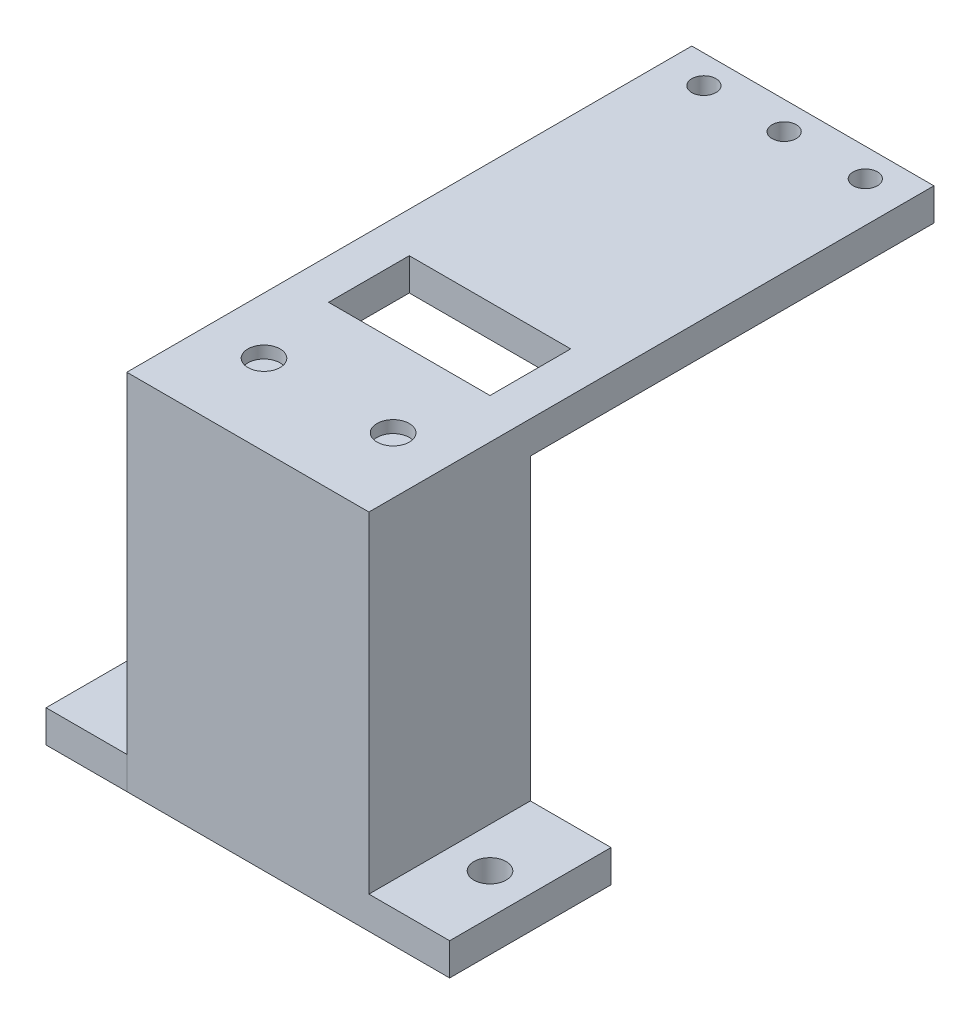
ISO-10303-21;
HEADER;
FILE_DESCRIPTION(('STEP AP214'),'2;1');
FILE_NAME('part.step','',(''),(''),'','','');
FILE_SCHEMA(('AUTOMOTIVE_DESIGN { 1 0 10303 214 1 1 1 1 }'));
ENDSEC;
DATA;
#1=APPLICATION_CONTEXT('core data for automotive mechanical design processes');
#2=APPLICATION_PROTOCOL_DEFINITION('international standard','automotive_design',2000,#1);
#3=PRODUCT_CONTEXT('',#1,'mechanical');
#4=PRODUCT('Part','Part','',(#3));
#5=PRODUCT_RELATED_PRODUCT_CATEGORY('part','',(#4));
#6=PRODUCT_DEFINITION_FORMATION('','',#4);
#7=PRODUCT_DEFINITION_CONTEXT('part definition',#1,'design');
#8=PRODUCT_DEFINITION('design','',#6,#7);
#9=PRODUCT_DEFINITION_SHAPE('','',#8);
#10=(LENGTH_UNIT() NAMED_UNIT(*) SI_UNIT(.MILLI.,.METRE.));
#11=(NAMED_UNIT(*) PLANE_ANGLE_UNIT() SI_UNIT($,.RADIAN.));
#12=(NAMED_UNIT(*) SI_UNIT($,.STERADIAN.) SOLID_ANGLE_UNIT());
#13=UNCERTAINTY_MEASURE_WITH_UNIT(LENGTH_MEASURE(1.E-05),#10,'distance_accuracy_value','');
#14=(GEOMETRIC_REPRESENTATION_CONTEXT(3) GLOBAL_UNCERTAINTY_ASSIGNED_CONTEXT((#13)) GLOBAL_UNIT_ASSIGNED_CONTEXT((#10,
#11,#12)) REPRESENTATION_CONTEXT('',''));
#15=CARTESIAN_POINT('',(0.,0.,0.));
#16=DIRECTION('',(0.,0.,1.));
#17=DIRECTION('',(1.,0.,0.));
#18=AXIS2_PLACEMENT_3D('',#15,#16,#17);
#19=CARTESIAN_POINT('',(0.,4.,-20.));
#20=DIRECTION('',(0.,0.,1.));
#21=DIRECTION('',(1.,0.,0.));
#22=AXIS2_PLACEMENT_3D('',#19,#20,#21);
#23=PLANE('',#22);
#24=DIRECTION('',(-1.,0.,0.));
#25=VECTOR('',#24,1.);
#26=CARTESIAN_POINT('',(0.,0.,-20.));
#27=LINE('',#26,#25);
#28=CARTESIAN_POINT('',(0.,0.,-20.));
#29=VERTEX_POINT('',#28);
#30=CARTESIAN_POINT('',(-10.,0.,-20.));
#31=VERTEX_POINT('',#30);
#32=EDGE_CURVE('E115',#29,#31,#27,.T.);
#33=ORIENTED_EDGE('',*,*,#32,.T.);
#34=DIRECTION('',(0.,-1.,0.));
#35=VECTOR('',#34,1.);
#36=CARTESIAN_POINT('',(-10.,4.,-20.));
#37=LINE('',#36,#35);
#38=CARTESIAN_POINT('',(-10.,4.,-20.));
#39=VERTEX_POINT('',#38);
#40=EDGE_CURVE('E12',#39,#31,#37,.T.);
#41=ORIENTED_EDGE('',*,*,#40,.F.);
#42=DIRECTION('',(-1.,0.,0.));
#43=VECTOR('',#42,1.);
#44=CARTESIAN_POINT('',(0.,4.,-20.));
#45=LINE('',#44,#43);
#46=CARTESIAN_POINT('',(0.,4.,-20.));
#47=VERTEX_POINT('',#46);
#48=EDGE_CURVE('E92',#47,#39,#45,.T.);
#49=ORIENTED_EDGE('',*,*,#48,.F.);
#50=DIRECTION('',(0.,-1.,0.));
#51=VECTOR('',#50,1.);
#52=CARTESIAN_POINT('',(0.,4.,-20.));
#53=LINE('',#52,#51);
#54=EDGE_CURVE('E111',#47,#29,#53,.T.);
#55=ORIENTED_EDGE('',*,*,#54,.T.);
#56=EDGE_LOOP('',(#33,#41,#49,#55));
#57=FACE_BOUND('',#56,.T.);
#58=ADVANCED_FACE('F53',(#57),#23,.F.);
#59=CARTESIAN_POINT('',(-10.,4.,0.));
#60=DIRECTION('',(-1.,0.,0.));
#61=DIRECTION('',(0.,0.,1.));
#62=AXIS2_PLACEMENT_3D('',#59,#60,#61);
#63=PLANE('',#62);
#64=DIRECTION('',(0.,0.,-1.));
#65=VECTOR('',#64,1.);
#66=CARTESIAN_POINT('',(-10.,0.,0.));
#67=LINE('',#66,#65);
#68=CARTESIAN_POINT('',(-10.,0.,0.));
#69=VERTEX_POINT('',#68);
#70=EDGE_CURVE('E101',#69,#31,#67,.T.);
#71=ORIENTED_EDGE('',*,*,#70,.F.);
#72=DIRECTION('',(0.,-1.,0.));
#73=VECTOR('',#72,1.);
#74=CARTESIAN_POINT('',(-10.,4.,0.));
#75=LINE('',#74,#73);
#76=CARTESIAN_POINT('',(-10.,4.,0.));
#77=VERTEX_POINT('',#76);
#78=EDGE_CURVE('E61',#77,#69,#75,.T.);
#79=ORIENTED_EDGE('',*,*,#78,.F.);
#80=DIRECTION('',(0.,0.,-1.));
#81=VECTOR('',#80,1.);
#82=CARTESIAN_POINT('',(-10.,4.,0.));
#83=LINE('',#82,#81);
#84=EDGE_CURVE('E99',#77,#39,#83,.T.);
#85=ORIENTED_EDGE('',*,*,#84,.T.);
#86=ORIENTED_EDGE('',*,*,#40,.T.);
#87=EDGE_LOOP('',(#71,#79,#85,#86));
#88=FACE_BOUND('',#87,.T.);
#89=ADVANCED_FACE('F98',(#88),#63,.T.);
#90=CARTESIAN_POINT('',(0.,4.,0.));
#91=DIRECTION('',(0.,0.,1.));
#92=DIRECTION('',(1.,0.,0.));
#93=AXIS2_PLACEMENT_3D('',#90,#91,#92);
#94=PLANE('',#93);
#95=DIRECTION('',(-1.,0.,0.));
#96=VECTOR('',#95,1.);
#97=CARTESIAN_POINT('',(0.,0.,0.));
#98=LINE('',#97,#96);
#99=CARTESIAN_POINT('',(0.,0.,0.));
#100=VERTEX_POINT('',#99);
#101=EDGE_CURVE('E120',#100,#69,#98,.T.);
#102=ORIENTED_EDGE('',*,*,#101,.F.);
#103=DIRECTION('',(0.,-1.,0.));
#104=VECTOR('',#103,1.);
#105=CARTESIAN_POINT('',(0.,4.,0.));
#106=LINE('',#105,#104);
#107=CARTESIAN_POINT('',(0.,4.,0.));
#108=VERTEX_POINT('',#107);
#109=EDGE_CURVE('E84',#108,#100,#106,.T.);
#110=ORIENTED_EDGE('',*,*,#109,.F.);
#111=DIRECTION('',(-1.,0.,0.));
#112=VECTOR('',#111,1.);
#113=CARTESIAN_POINT('',(0.,4.,0.));
#114=LINE('',#113,#112);
#115=EDGE_CURVE('E107',#108,#77,#114,.T.);
#116=ORIENTED_EDGE('',*,*,#115,.T.);
#117=ORIENTED_EDGE('',*,*,#78,.T.);
#118=EDGE_LOOP('',(#102,#110,#116,#117));
#119=FACE_BOUND('',#118,.T.);
#120=ADVANCED_FACE('F109',(#119),#94,.T.);
#121=CARTESIAN_POINT('',(0.,4.,0.));
#122=DIRECTION('',(-1.,0.,0.));
#123=DIRECTION('',(0.,0.,1.));
#124=AXIS2_PLACEMENT_3D('',#121,#122,#123);
#125=PLANE('',#124);
#126=DIRECTION('',(0.,0.,-1.));
#127=VECTOR('',#126,1.);
#128=CARTESIAN_POINT('',(0.,0.,0.));
#129=LINE('',#128,#127);
#130=EDGE_CURVE('E87',#100,#29,#129,.T.);
#131=ORIENTED_EDGE('',*,*,#130,.T.);
#132=ORIENTED_EDGE('',*,*,#54,.F.);
#133=DIRECTION('',(0.,0.,-1.));
#134=VECTOR('',#133,1.);
#135=CARTESIAN_POINT('',(0.,4.,0.));
#136=LINE('',#135,#134);
#137=EDGE_CURVE('E69',#108,#47,#136,.T.);
#138=ORIENTED_EDGE('',*,*,#137,.F.);
#139=ORIENTED_EDGE('',*,*,#109,.T.);
#140=EDGE_LOOP('',(#131,#132,#138,#139));
#141=FACE_BOUND('',#140,.T.);
#142=ADVANCED_FACE('F138',(#141),#125,.F.);
#143=CARTESIAN_POINT('',(0.,4.,0.));
#144=DIRECTION('',(0.,-1.,0.));
#145=DIRECTION('',(0.,0.,-1.));
#146=AXIS2_PLACEMENT_3D('',#143,#144,#145);
#147=PLANE('',#146);
#148=CARTESIAN_POINT('',(-5.,4.,-10.));
#149=DIRECTION('',(0.,-1.,0.));
#150=DIRECTION('',(0.,0.,-1.));
#151=AXIS2_PLACEMENT_3D('',#148,#149,#150);
#152=CIRCLE('',#151,2.);
#153=CARTESIAN_POINT('',(-5.,4.,-12.));
#154=VERTEX_POINT('',#153);
#155=EDGE_CURVE('E118',#154,#154,#152,.T.);
#156=ORIENTED_EDGE('',*,*,#155,.T.);
#157=EDGE_LOOP('',(#156));
#158=FACE_BOUND('',#157,.T.);
#159=ORIENTED_EDGE('',*,*,#48,.T.);
#160=ORIENTED_EDGE('',*,*,#84,.F.);
#161=ORIENTED_EDGE('',*,*,#115,.F.);
#162=ORIENTED_EDGE('',*,*,#137,.T.);
#163=EDGE_LOOP('',(#159,#160,#161,#162));
#164=FACE_BOUND('',#163,.T.);
#165=ADVANCED_FACE('F106',(#158,#164),#147,.F.);
#166=CARTESIAN_POINT('',(0.,0.,0.));
#167=DIRECTION('',(0.,-1.,0.));
#168=DIRECTION('',(0.,0.,-1.));
#169=AXIS2_PLACEMENT_3D('',#166,#167,#168);
#170=PLANE('',#169);
#171=CARTESIAN_POINT('',(-5.,0.,-10.));
#172=DIRECTION('',(0.,-1.,0.));
#173=DIRECTION('',(0.,0.,-1.));
#174=AXIS2_PLACEMENT_3D('',#171,#172,#173);
#175=CIRCLE('',#174,2.);
#176=CARTESIAN_POINT('',(-5.,0.,-12.));
#177=VERTEX_POINT('',#176);
#178=EDGE_CURVE('E203',#177,#177,#175,.T.);
#179=ORIENTED_EDGE('',*,*,#178,.F.);
#180=EDGE_LOOP('',(#179));
#181=FACE_BOUND('',#180,.T.);
#182=ORIENTED_EDGE('',*,*,#32,.F.);
#183=ORIENTED_EDGE('',*,*,#130,.F.);
#184=ORIENTED_EDGE('',*,*,#101,.T.);
#185=ORIENTED_EDGE('',*,*,#70,.T.);
#186=EDGE_LOOP('',(#182,#183,#184,#185));
#187=FACE_BOUND('',#186,.T.);
#188=ADVANCED_FACE('F127',(#181,#187),#170,.T.);
#189=CARTESIAN_POINT('',(-5.,4.,-10.));
#190=DIRECTION('',(0.,-1.,0.));
#191=DIRECTION('',(0.,0.,-1.));
#192=AXIS2_PLACEMENT_3D('',#189,#190,#191);
#193=CYLINDRICAL_SURFACE('',#192,2.);
#194=ORIENTED_EDGE('',*,*,#155,.F.);
#195=EDGE_LOOP('',(#194));
#196=FACE_BOUND('',#195,.T.);
#197=ORIENTED_EDGE('',*,*,#178,.T.);
#198=EDGE_LOOP('',(#197));
#199=FACE_BOUND('',#198,.T.);
#200=ADVANCED_FACE('F129',(#196,#199),#193,.F.);
#201=CLOSED_SHELL('',(#58,#89,#120,#142,#165,#188,#200));
#202=MANIFOLD_SOLID_BREP('B2',#201);
#203=CARTESIAN_POINT('',(0.,45.,-20.));
#204=DIRECTION('',(0.,0.,1.));
#205=DIRECTION('',(1.,0.,0.));
#206=AXIS2_PLACEMENT_3D('',#203,#204,#205);
#207=PLANE('',#206);
#208=DIRECTION('',(-1.,0.,0.));
#209=VECTOR('',#208,1.);
#210=CARTESIAN_POINT('',(0.,41.,-20.));
#211=LINE('',#210,#209);
#212=CARTESIAN_POINT('',(30.,41.,-20.));
#213=VERTEX_POINT('',#212);
#214=CARTESIAN_POINT('',(25.,41.,-20.));
#215=VERTEX_POINT('',#214);
#216=EDGE_CURVE('E302',#213,#215,#211,.T.);
#217=ORIENTED_EDGE('',*,*,#216,.F.);
#218=DIRECTION('',(0.,-1.,0.));
#219=VECTOR('',#218,1.);
#220=CARTESIAN_POINT('',(30.,45.,-20.));
#221=LINE('',#220,#219);
#222=CARTESIAN_POINT('',(30.,4.00000000000002,-20.));
#223=VERTEX_POINT('',#222);
#224=EDGE_CURVE('E419',#213,#223,#221,.T.);
#225=ORIENTED_EDGE('',*,*,#224,.T.);
#226=DIRECTION('',(1.,0.,0.));
#227=VECTOR('',#226,1.);
#228=CARTESIAN_POINT('',(30.,4.,-20.));
#229=LINE('',#228,#227);
#230=CARTESIAN_POINT('',(40.,4.,-20.));
#231=VERTEX_POINT('',#230);
#232=EDGE_CURVE('E372',#223,#231,#229,.T.);
#233=ORIENTED_EDGE('',*,*,#232,.T.);
#234=DIRECTION('',(0.,-1.,0.));
#235=VECTOR('',#234,1.);
#236=CARTESIAN_POINT('',(40.,4.,-20.));
#237=LINE('',#236,#235);
#238=CARTESIAN_POINT('',(40.,0.,-20.));
#239=VERTEX_POINT('',#238);
#240=EDGE_CURVE('E384',#231,#239,#237,.T.);
#241=ORIENTED_EDGE('',*,*,#240,.T.);
#242=DIRECTION('',(-1.,0.,0.));
#243=VECTOR('',#242,1.);
#244=CARTESIAN_POINT('',(0.,0.,-20.));
#245=LINE('',#244,#243);
#246=CARTESIAN_POINT('',(0.,0.,-20.));
#247=VERTEX_POINT('',#246);
#248=EDGE_CURVE('E401',#239,#247,#245,.T.);
#249=ORIENTED_EDGE('',*,*,#248,.T.);
#250=DIRECTION('',(0.,-1.,0.));
#251=VECTOR('',#250,1.);
#252=CARTESIAN_POINT('',(0.,45.,-20.));
#253=LINE('',#252,#251);
#254=CARTESIAN_POINT('',(0.,41.,-20.));
#255=VERTEX_POINT('',#254);
#256=EDGE_CURVE('E407',#255,#247,#253,.T.);
#257=ORIENTED_EDGE('',*,*,#256,.F.);
#258=CARTESIAN_POINT('',(5.00000000000001,41.,-20.));
#259=VERTEX_POINT('',#258);
#260=EDGE_CURVE('E325',#259,#255,#211,.T.);
#261=ORIENTED_EDGE('',*,*,#260,.F.);
#262=DIRECTION('',(0.,1.,0.));
#263=VECTOR('',#262,1.);
#264=CARTESIAN_POINT('',(5.00000000000001,41.,-20.));
#265=LINE('',#264,#263);
#266=CARTESIAN_POINT('',(5.00000000000001,45.,-20.));
#267=VERTEX_POINT('',#266);
#268=EDGE_CURVE('E332',#259,#267,#265,.T.);
#269=ORIENTED_EDGE('',*,*,#268,.T.);
#270=DIRECTION('',(1.,0.,0.));
#271=VECTOR('',#270,1.);
#272=CARTESIAN_POINT('',(5.00000000000001,45.,-20.));
#273=LINE('',#272,#271);
#274=CARTESIAN_POINT('',(25.,45.,-20.));
#275=VERTEX_POINT('',#274);
#276=EDGE_CURVE('E228',#267,#275,#273,.T.);
#277=ORIENTED_EDGE('',*,*,#276,.T.);
#278=DIRECTION('',(0.,1.,0.));
#279=VECTOR('',#278,1.);
#280=CARTESIAN_POINT('',(25.,41.,-20.));
#281=LINE('',#280,#279);
#282=EDGE_CURVE('E299',#215,#275,#281,.T.);
#283=ORIENTED_EDGE('',*,*,#282,.F.);
#284=EDGE_LOOP('',(#217,#225,#233,#241,#249,#257,#261,#269,#277,#283));
#285=FACE_BOUND('',#284,.T.);
#286=ADVANCED_FACE('F212',(#285),#207,.F.);
#287=CARTESIAN_POINT('',(0.,45.,0.));
#288=DIRECTION('',(1.,0.,0.));
#289=DIRECTION('',(0.,0.,-1.));
#290=AXIS2_PLACEMENT_3D('',#287,#288,#289);
#291=PLANE('',#290);
#292=DIRECTION('',(0.,0.,1.));
#293=VECTOR('',#292,1.);
#294=CARTESIAN_POINT('',(0.,0.,0.));
#295=LINE('',#294,#293);
#296=CARTESIAN_POINT('',(0.,0.,0.));
#297=VERTEX_POINT('',#296);
#298=EDGE_CURVE('E392',#247,#297,#295,.T.);
#299=ORIENTED_EDGE('',*,*,#298,.T.);
#300=DIRECTION('',(0.,-1.,0.));
#301=VECTOR('',#300,1.);
#302=CARTESIAN_POINT('',(0.,45.,0.));
#303=LINE('',#302,#301);
#304=CARTESIAN_POINT('',(0.,45.,0.));
#305=VERTEX_POINT('',#304);
#306=EDGE_CURVE('E51',#305,#297,#303,.T.);
#307=ORIENTED_EDGE('',*,*,#306,.F.);
#308=DIRECTION('',(0.,0.,1.));
#309=VECTOR('',#308,1.);
#310=CARTESIAN_POINT('',(0.,45.,0.));
#311=LINE('',#310,#309);
#312=CARTESIAN_POINT('',(0.,45.,-70.));
#313=VERTEX_POINT('',#312);
#314=EDGE_CURVE('E396',#313,#305,#311,.T.);
#315=ORIENTED_EDGE('',*,*,#314,.F.);
#316=DIRECTION('',(0.,1.,0.));
#317=VECTOR('',#316,1.);
#318=CARTESIAN_POINT('',(0.,45.,-70.));
#319=LINE('',#318,#317);
#320=CARTESIAN_POINT('',(0.,41.,-70.));
#321=VERTEX_POINT('',#320);
#322=EDGE_CURVE('E324',#321,#313,#319,.T.);
#323=ORIENTED_EDGE('',*,*,#322,.F.);
#324=DIRECTION('',(0.,0.,1.));
#325=VECTOR('',#324,1.);
#326=CARTESIAN_POINT('',(0.,41.,-70.));
#327=LINE('',#326,#325);
#328=EDGE_CURVE('E337',#321,#255,#327,.T.);
#329=ORIENTED_EDGE('',*,*,#328,.T.);
#330=ORIENTED_EDGE('',*,*,#256,.T.);
#331=EDGE_LOOP('',(#299,#307,#315,#323,#329,#330));
#332=FACE_BOUND('',#331,.T.);
#333=ADVANCED_FACE('F214',(#332),#291,.F.);
#334=CARTESIAN_POINT('',(0.,45.,0.));
#335=DIRECTION('',(0.,0.,-1.));
#336=DIRECTION('',(-1.,0.,0.));
#337=AXIS2_PLACEMENT_3D('',#334,#335,#336);
#338=PLANE('',#337);
#339=DIRECTION('',(1.,0.,0.));
#340=VECTOR('',#339,1.);
#341=CARTESIAN_POINT('',(0.,0.,0.));
#342=LINE('',#341,#340);
#343=CARTESIAN_POINT('',(40.,0.,0.));
#344=VERTEX_POINT('',#343);
#345=EDGE_CURVE('E411',#297,#344,#342,.T.);
#346=ORIENTED_EDGE('',*,*,#345,.T.);
#347=DIRECTION('',(0.,-1.,0.));
#348=VECTOR('',#347,1.);
#349=CARTESIAN_POINT('',(40.,4.,0.));
#350=LINE('',#349,#348);
#351=CARTESIAN_POINT('',(40.,4.,0.));
#352=VERTEX_POINT('',#351);
#353=EDGE_CURVE('E388',#352,#344,#350,.T.);
#354=ORIENTED_EDGE('',*,*,#353,.F.);
#355=DIRECTION('',(-1.,0.,0.));
#356=VECTOR('',#355,1.);
#357=CARTESIAN_POINT('',(30.,4.,0.));
#358=LINE('',#357,#356);
#359=CARTESIAN_POINT('',(30.,4.,0.));
#360=VERTEX_POINT('',#359);
#361=EDGE_CURVE('E380',#352,#360,#358,.T.);
#362=ORIENTED_EDGE('',*,*,#361,.T.);
#363=DIRECTION('',(0.,-1.,0.));
#364=VECTOR('',#363,1.);
#365=CARTESIAN_POINT('',(30.,45.,0.));
#366=LINE('',#365,#364);
#367=CARTESIAN_POINT('',(30.,45.,0.));
#368=VERTEX_POINT('',#367);
#369=EDGE_CURVE('E221',#368,#360,#366,.T.);
#370=ORIENTED_EDGE('',*,*,#369,.F.);
#371=DIRECTION('',(1.,0.,0.));
#372=VECTOR('',#371,1.);
#373=CARTESIAN_POINT('',(0.,45.,0.));
#374=LINE('',#373,#372);
#375=EDGE_CURVE('E400',#305,#368,#374,.T.);
#376=ORIENTED_EDGE('',*,*,#375,.F.);
#377=ORIENTED_EDGE('',*,*,#306,.T.);
#378=EDGE_LOOP('',(#346,#354,#362,#370,#376,#377));
#379=FACE_BOUND('',#378,.T.);
#380=ADVANCED_FACE('F429',(#379),#338,.F.);
#381=CARTESIAN_POINT('',(30.,45.,0.));
#382=DIRECTION('',(-1.,0.,0.));
#383=DIRECTION('',(0.,0.,1.));
#384=AXIS2_PLACEMENT_3D('',#381,#382,#383);
#385=PLANE('',#384);
#386=ORIENTED_EDGE('',*,*,#369,.T.);
#387=DIRECTION('',(0.,0.,-1.));
#388=VECTOR('',#387,1.);
#389=CARTESIAN_POINT('',(30.,4.,0.));
#390=LINE('',#389,#388);
#391=EDGE_CURVE('E368',#360,#223,#390,.T.);
#392=ORIENTED_EDGE('',*,*,#391,.T.);
#393=ORIENTED_EDGE('',*,*,#224,.F.);
#394=DIRECTION('',(0.,0.,1.));
#395=VECTOR('',#394,1.);
#396=CARTESIAN_POINT('',(30.,41.,-70.));
#397=LINE('',#396,#395);
#398=CARTESIAN_POINT('',(30.,41.,-70.));
#399=VERTEX_POINT('',#398);
#400=EDGE_CURVE('E322',#399,#213,#397,.T.);
#401=ORIENTED_EDGE('',*,*,#400,.F.);
#402=DIRECTION('',(0.,-1.,0.));
#403=VECTOR('',#402,1.);
#404=CARTESIAN_POINT('',(30.,45.,-70.));
#405=LINE('',#404,#403);
#406=CARTESIAN_POINT('',(30.,45.,-70.));
#407=VERTEX_POINT('',#406);
#408=EDGE_CURVE('E436',#407,#399,#405,.T.);
#409=ORIENTED_EDGE('',*,*,#408,.F.);
#410=DIRECTION('',(0.,0.,-1.));
#411=VECTOR('',#410,1.);
#412=CARTESIAN_POINT('',(30.,45.,0.));
#413=LINE('',#412,#411);
#414=EDGE_CURVE('E404',#368,#407,#413,.T.);
#415=ORIENTED_EDGE('',*,*,#414,.F.);
#416=EDGE_LOOP('',(#386,#392,#393,#401,#409,#415));
#417=FACE_BOUND('',#416,.T.);
#418=ADVANCED_FACE('F426',(#417),#385,.F.);
#419=CARTESIAN_POINT('',(0.,45.,0.));
#420=DIRECTION('',(0.,-1.,0.));
#421=DIRECTION('',(0.,0.,-1.));
#422=AXIS2_PLACEMENT_3D('',#419,#420,#421);
#423=PLANE('',#422);
#424=CARTESIAN_POINT('',(25.,45.,-66.5));
#425=DIRECTION('',(0.,1.,0.));
#426=DIRECTION('',(0.,0.,1.));
#427=AXIS2_PLACEMENT_3D('',#424,#425,#426);
#428=CIRCLE('',#427,1.5);
#429=CARTESIAN_POINT('',(25.,45.,-65.));
#430=VERTEX_POINT('',#429);
#431=EDGE_CURVE('E487',#430,#430,#428,.T.);
#432=ORIENTED_EDGE('',*,*,#431,.F.);
#433=EDGE_LOOP('',(#432));
#434=FACE_BOUND('',#433,.T.);
#435=CARTESIAN_POINT('',(14.9116155617258,45.,-66.5329018329615));
#436=DIRECTION('',(0.,1.,0.));
#437=DIRECTION('',(0.,0.,1.));
#438=AXIS2_PLACEMENT_3D('',#435,#436,#437);
#439=CIRCLE('',#438,1.5);
#440=CARTESIAN_POINT('',(14.9116155617258,45.,-65.0329018329615));
#441=VERTEX_POINT('',#440);
#442=EDGE_CURVE('E483',#441,#441,#439,.T.);
#443=ORIENTED_EDGE('',*,*,#442,.F.);
#444=EDGE_LOOP('',(#443));
#445=FACE_BOUND('',#444,.T.);
#446=CARTESIAN_POINT('',(5.,45.,-66.5));
#447=DIRECTION('',(0.,1.,0.));
#448=DIRECTION('',(0.,0.,1.));
#449=AXIS2_PLACEMENT_3D('',#446,#447,#448);
#450=CIRCLE('',#449,1.5);
#451=CARTESIAN_POINT('',(5.,45.,-65.));
#452=VERTEX_POINT('',#451);
#453=EDGE_CURVE('E475',#452,#452,#450,.T.);
#454=ORIENTED_EDGE('',*,*,#453,.F.);
#455=EDGE_LOOP('',(#454));
#456=FACE_BOUND('',#455,.T.);
#457=DIRECTION('',(0.,0.,-1.));
#458=VECTOR('',#457,1.);
#459=CARTESIAN_POINT('',(25.,45.,-30.));
#460=LINE('',#459,#458);
#461=CARTESIAN_POINT('',(25.,45.,-30.));
#462=VERTEX_POINT('',#461);
#463=EDGE_CURVE('E460',#275,#462,#460,.T.);
#464=ORIENTED_EDGE('',*,*,#463,.F.);
#465=ORIENTED_EDGE('',*,*,#276,.F.);
#466=DIRECTION('',(0.,0.,1.));
#467=VECTOR('',#466,1.);
#468=CARTESIAN_POINT('',(5.,45.,-30.));
#469=LINE('',#468,#467);
#470=CARTESIAN_POINT('',(5.,45.,-30.));
#471=VERTEX_POINT('',#470);
#472=EDGE_CURVE('E316',#471,#267,#469,.T.);
#473=ORIENTED_EDGE('',*,*,#472,.F.);
#474=DIRECTION('',(-1.,0.,0.));
#475=VECTOR('',#474,1.);
#476=CARTESIAN_POINT('',(25.,45.,-30.));
#477=LINE('',#476,#475);
#478=EDGE_CURVE('E456',#462,#471,#477,.T.);
#479=ORIENTED_EDGE('',*,*,#478,.F.);
#480=EDGE_LOOP('',(#464,#465,#473,#479));
#481=FACE_BOUND('',#480,.T.);
#482=CARTESIAN_POINT('',(7.,45.,-10.));
#483=DIRECTION('',(0.,1.,0.));
#484=DIRECTION('',(0.,0.,1.));
#485=AXIS2_PLACEMENT_3D('',#482,#483,#484);
#486=CIRCLE('',#485,2.);
#487=CARTESIAN_POINT('',(7.,45.,-8.));
#488=VERTEX_POINT('',#487);
#489=EDGE_CURVE('E349',#488,#488,#486,.T.);
#490=ORIENTED_EDGE('',*,*,#489,.F.);
#491=EDGE_LOOP('',(#490));
#492=FACE_BOUND('',#491,.T.);
#493=CARTESIAN_POINT('',(23.,45.,-10.));
#494=DIRECTION('',(0.,1.,0.));
#495=DIRECTION('',(0.,0.,1.));
#496=AXIS2_PLACEMENT_3D('',#493,#494,#495);
#497=CIRCLE('',#496,2.);
#498=CARTESIAN_POINT('',(23.,45.,-8.));
#499=VERTEX_POINT('',#498);
#500=EDGE_CURVE('E343',#499,#499,#497,.T.);
#501=ORIENTED_EDGE('',*,*,#500,.F.);
#502=EDGE_LOOP('',(#501));
#503=FACE_BOUND('',#502,.T.);
#504=ORIENTED_EDGE('',*,*,#314,.T.);
#505=ORIENTED_EDGE('',*,*,#375,.T.);
#506=ORIENTED_EDGE('',*,*,#414,.T.);
#507=DIRECTION('',(1.,0.,0.));
#508=VECTOR('',#507,1.);
#509=CARTESIAN_POINT('',(0.,45.,-70.));
#510=LINE('',#509,#508);
#511=EDGE_CURVE('E330',#313,#407,#510,.T.);
#512=ORIENTED_EDGE('',*,*,#511,.F.);
#513=EDGE_LOOP('',(#504,#505,#506,#512));
#514=FACE_BOUND('',#513,.T.);
#515=ADVANCED_FACE('F504',(#434,#445,#456,#481,#492,#503,#514),#423,.F.);
#516=CARTESIAN_POINT('',(0.,0.,0.));
#517=DIRECTION('',(0.,-1.,0.));
#518=DIRECTION('',(0.,0.,-1.));
#519=AXIS2_PLACEMENT_3D('',#516,#517,#518);
#520=PLANE('',#519);
#521=CARTESIAN_POINT('',(35.,0.,-10.));
#522=DIRECTION('',(0.,-1.,0.));
#523=DIRECTION('',(0.,0.,-1.));
#524=AXIS2_PLACEMENT_3D('',#521,#522,#523);
#525=CIRCLE('',#524,2.);
#526=CARTESIAN_POINT('',(35.,0.,-12.));
#527=VERTEX_POINT('',#526);
#528=EDGE_CURVE('E348',#527,#527,#525,.T.);
#529=ORIENTED_EDGE('',*,*,#528,.F.);
#530=EDGE_LOOP('',(#529));
#531=FACE_BOUND('',#530,.T.);
#532=ORIENTED_EDGE('',*,*,#298,.F.);
#533=ORIENTED_EDGE('',*,*,#248,.F.);
#534=DIRECTION('',(0.,0.,1.));
#535=VECTOR('',#534,1.);
#536=CARTESIAN_POINT('',(40.,0.,0.));
#537=LINE('',#536,#535);
#538=EDGE_CURVE('E364',#239,#344,#537,.T.);
#539=ORIENTED_EDGE('',*,*,#538,.T.);
#540=ORIENTED_EDGE('',*,*,#345,.F.);
#541=EDGE_LOOP('',(#532,#533,#539,#540));
#542=FACE_BOUND('',#541,.T.);
#543=ADVANCED_FACE('F507',(#531,#542),#520,.T.);
#544=CARTESIAN_POINT('',(40.,4.,0.));
#545=DIRECTION('',(1.,0.,0.));
#546=DIRECTION('',(0.,0.,-1.));
#547=AXIS2_PLACEMENT_3D('',#544,#545,#546);
#548=PLANE('',#547);
#549=ORIENTED_EDGE('',*,*,#538,.F.);
#550=ORIENTED_EDGE('',*,*,#240,.F.);
#551=DIRECTION('',(0.,0.,1.));
#552=VECTOR('',#551,1.);
#553=CARTESIAN_POINT('',(40.,4.,0.));
#554=LINE('',#553,#552);
#555=EDGE_CURVE('E376',#231,#352,#554,.T.);
#556=ORIENTED_EDGE('',*,*,#555,.T.);
#557=ORIENTED_EDGE('',*,*,#353,.T.);
#558=EDGE_LOOP('',(#549,#550,#556,#557));
#559=FACE_BOUND('',#558,.T.);
#560=ADVANCED_FACE('F525',(#559),#548,.T.);
#561=CARTESIAN_POINT('',(0.,4.,0.));
#562=DIRECTION('',(0.,-1.,0.));
#563=DIRECTION('',(0.,0.,-1.));
#564=AXIS2_PLACEMENT_3D('',#561,#562,#563);
#565=PLANE('',#564);
#566=CARTESIAN_POINT('',(35.,4.,-10.));
#567=DIRECTION('',(0.,-1.,0.));
#568=DIRECTION('',(0.,0.,-1.));
#569=AXIS2_PLACEMENT_3D('',#566,#567,#568);
#570=CIRCLE('',#569,2.);
#571=CARTESIAN_POINT('',(35.,4.,-12.));
#572=VERTEX_POINT('',#571);
#573=EDGE_CURVE('E360',#572,#572,#570,.T.);
#574=ORIENTED_EDGE('',*,*,#573,.T.);
#575=EDGE_LOOP('',(#574));
#576=FACE_BOUND('',#575,.T.);
#577=ORIENTED_EDGE('',*,*,#391,.F.);
#578=ORIENTED_EDGE('',*,*,#361,.F.);
#579=ORIENTED_EDGE('',*,*,#555,.F.);
#580=ORIENTED_EDGE('',*,*,#232,.F.);
#581=EDGE_LOOP('',(#577,#578,#579,#580));
#582=FACE_BOUND('',#581,.T.);
#583=ADVANCED_FACE('F433',(#576,#582),#565,.F.);
#584=CARTESIAN_POINT('',(35.,4.,-10.));
#585=DIRECTION('',(0.,-1.,0.));
#586=DIRECTION('',(0.,0.,-1.));
#587=AXIS2_PLACEMENT_3D('',#584,#585,#586);
#588=CYLINDRICAL_SURFACE('',#587,2.);
#589=ORIENTED_EDGE('',*,*,#573,.F.);
#590=EDGE_LOOP('',(#589));
#591=FACE_BOUND('',#590,.T.);
#592=ORIENTED_EDGE('',*,*,#528,.T.);
#593=EDGE_LOOP('',(#592));
#594=FACE_BOUND('',#593,.T.);
#595=ADVANCED_FACE('F583',(#591,#594),#588,.F.);
#596=CARTESIAN_POINT('',(23.,43.5,-10.));
#597=DIRECTION('',(0.,1.,0.));
#598=DIRECTION('',(0.,0.,1.));
#599=AXIS2_PLACEMENT_3D('',#596,#597,#598);
#600=CYLINDRICAL_SURFACE('',#599,2.);
#601=CARTESIAN_POINT('',(23.,43.5,-10.));
#602=DIRECTION('',(0.,1.,0.));
#603=DIRECTION('',(0.,0.,1.));
#604=AXIS2_PLACEMENT_3D('',#601,#602,#603);
#605=CIRCLE('',#604,2.);
#606=CARTESIAN_POINT('',(23.,43.5,-8.));
#607=VERTEX_POINT('',#606);
#608=EDGE_CURVE('E353',#607,#607,#605,.T.);
#609=ORIENTED_EDGE('',*,*,#608,.F.);
#610=EDGE_LOOP('',(#609));
#611=FACE_BOUND('',#610,.T.);
#612=ORIENTED_EDGE('',*,*,#500,.T.);
#613=EDGE_LOOP('',(#612));
#614=FACE_BOUND('',#613,.T.);
#615=ADVANCED_FACE('F591',(#611,#614),#600,.F.);
#616=CARTESIAN_POINT('',(0.,43.5,0.));
#617=DIRECTION('',(0.,1.,0.));
#618=DIRECTION('',(0.,0.,1.));
#619=AXIS2_PLACEMENT_3D('',#616,#617,#618);
#620=PLANE('',#619);
#621=ORIENTED_EDGE('',*,*,#608,.T.);
#622=EDGE_LOOP('',(#621));
#623=FACE_BOUND('',#622,.T.);
#624=ADVANCED_FACE('F599',(#623),#620,.T.);
#625=CARTESIAN_POINT('',(7.,43.5,-10.));
#626=DIRECTION('',(0.,1.,0.));
#627=DIRECTION('',(0.,0.,1.));
#628=AXIS2_PLACEMENT_3D('',#625,#626,#627);
#629=CYLINDRICAL_SURFACE('',#628,2.);
#630=CARTESIAN_POINT('',(7.,43.5,-10.));
#631=DIRECTION('',(0.,1.,0.));
#632=DIRECTION('',(0.,0.,1.));
#633=AXIS2_PLACEMENT_3D('',#630,#631,#632);
#634=CIRCLE('',#633,2.);
#635=CARTESIAN_POINT('',(7.,43.5,-8.));
#636=VERTEX_POINT('',#635);
#637=EDGE_CURVE('E344',#636,#636,#634,.T.);
#638=ORIENTED_EDGE('',*,*,#637,.F.);
#639=EDGE_LOOP('',(#638));
#640=FACE_BOUND('',#639,.T.);
#641=ORIENTED_EDGE('',*,*,#489,.T.);
#642=EDGE_LOOP('',(#641));
#643=FACE_BOUND('',#642,.T.);
#644=ADVANCED_FACE('F607',(#640,#643),#629,.F.);
#645=CARTESIAN_POINT('',(0.,43.5,0.));
#646=DIRECTION('',(0.,1.,0.));
#647=DIRECTION('',(0.,0.,1.));
#648=AXIS2_PLACEMENT_3D('',#645,#646,#647);
#649=PLANE('',#648);
#650=ORIENTED_EDGE('',*,*,#637,.T.);
#651=EDGE_LOOP('',(#650));
#652=FACE_BOUND('',#651,.T.);
#653=ADVANCED_FACE('F539',(#652),#649,.T.);
#654=CARTESIAN_POINT('',(0.,41.,-70.));
#655=DIRECTION('',(0.,1.,0.));
#656=DIRECTION('',(0.,0.,1.));
#657=AXIS2_PLACEMENT_3D('',#654,#655,#656);
#658=PLANE('',#657);
#659=CARTESIAN_POINT('',(25.,41.,-66.5));
#660=DIRECTION('',(0.,1.,0.));
#661=DIRECTION('',(0.,0.,1.));
#662=AXIS2_PLACEMENT_3D('',#659,#660,#661);
#663=CIRCLE('',#662,1.5);
#664=CARTESIAN_POINT('',(25.,41.,-65.));
#665=VERTEX_POINT('',#664);
#666=EDGE_CURVE('E465',#665,#665,#663,.T.);
#667=ORIENTED_EDGE('',*,*,#666,.T.);
#668=EDGE_LOOP('',(#667));
#669=FACE_BOUND('',#668,.T.);
#670=CARTESIAN_POINT('',(14.9116155617258,41.,-66.5329018329615));
#671=DIRECTION('',(0.,1.,0.));
#672=DIRECTION('',(0.,0.,1.));
#673=AXIS2_PLACEMENT_3D('',#670,#671,#672);
#674=CIRCLE('',#673,1.5);
#675=CARTESIAN_POINT('',(14.9116155617258,41.,-65.0329018329615));
#676=VERTEX_POINT('',#675);
#677=EDGE_CURVE('E479',#676,#676,#674,.T.);
#678=ORIENTED_EDGE('',*,*,#677,.T.);
#679=EDGE_LOOP('',(#678));
#680=FACE_BOUND('',#679,.T.);
#681=CARTESIAN_POINT('',(5.,41.,-66.5));
#682=DIRECTION('',(0.,1.,0.));
#683=DIRECTION('',(0.,0.,1.));
#684=AXIS2_PLACEMENT_3D('',#681,#682,#683);
#685=CIRCLE('',#684,1.5);
#686=CARTESIAN_POINT('',(5.,41.,-65.));
#687=VERTEX_POINT('',#686);
#688=EDGE_CURVE('E471',#687,#687,#685,.T.);
#689=ORIENTED_EDGE('',*,*,#688,.T.);
#690=EDGE_LOOP('',(#689));
#691=FACE_BOUND('',#690,.T.);
#692=DIRECTION('',(-1.,0.,0.));
#693=VECTOR('',#692,1.);
#694=CARTESIAN_POINT('',(25.,41.,-30.));
#695=LINE('',#694,#693);
#696=CARTESIAN_POINT('',(25.,41.,-30.));
#697=VERTEX_POINT('',#696);
#698=CARTESIAN_POINT('',(5.,41.,-30.));
#699=VERTEX_POINT('',#698);
#700=EDGE_CURVE('E236',#697,#699,#695,.T.);
#701=ORIENTED_EDGE('',*,*,#700,.T.);
#702=DIRECTION('',(0.,0.,1.));
#703=VECTOR('',#702,1.);
#704=CARTESIAN_POINT('',(5.,41.,-30.));
#705=LINE('',#704,#703);
#706=EDGE_CURVE('E309',#699,#259,#705,.T.);
#707=ORIENTED_EDGE('',*,*,#706,.T.);
#708=ORIENTED_EDGE('',*,*,#260,.T.);
#709=ORIENTED_EDGE('',*,*,#328,.F.);
#710=DIRECTION('',(-1.,0.,0.));
#711=VECTOR('',#710,1.);
#712=CARTESIAN_POINT('',(0.,41.,-70.));
#713=LINE('',#712,#711);
#714=EDGE_CURVE('E335',#399,#321,#713,.T.);
#715=ORIENTED_EDGE('',*,*,#714,.F.);
#716=ORIENTED_EDGE('',*,*,#400,.T.);
#717=ORIENTED_EDGE('',*,*,#216,.T.);
#718=DIRECTION('',(0.,0.,-1.));
#719=VECTOR('',#718,1.);
#720=CARTESIAN_POINT('',(25.,41.,-30.));
#721=LINE('',#720,#719);
#722=EDGE_CURVE('E312',#215,#697,#721,.T.);
#723=ORIENTED_EDGE('',*,*,#722,.T.);
#724=EDGE_LOOP('',(#701,#707,#708,#709,#715,#716,#717,#723));
#725=FACE_BOUND('',#724,.T.);
#726=ADVANCED_FACE('F319',(#669,#680,#691,#725),#658,.F.);
#727=CARTESIAN_POINT('',(0.,0.,-70.));
#728=DIRECTION('',(0.,0.,1.));
#729=DIRECTION('',(1.,0.,0.));
#730=AXIS2_PLACEMENT_3D('',#727,#728,#729);
#731=PLANE('',#730);
#732=ORIENTED_EDGE('',*,*,#322,.T.);
#733=ORIENTED_EDGE('',*,*,#511,.T.);
#734=ORIENTED_EDGE('',*,*,#408,.T.);
#735=ORIENTED_EDGE('',*,*,#714,.T.);
#736=EDGE_LOOP('',(#732,#733,#734,#735));
#737=FACE_BOUND('',#736,.T.);
#738=ADVANCED_FACE('F528',(#737),#731,.F.);
#739=CARTESIAN_POINT('',(5.,41.,-30.));
#740=DIRECTION('',(-1.,0.,0.));
#741=DIRECTION('',(0.,0.,1.));
#742=AXIS2_PLACEMENT_3D('',#739,#740,#741);
#743=PLANE('',#742);
#744=ORIENTED_EDGE('',*,*,#472,.T.);
#745=ORIENTED_EDGE('',*,*,#268,.F.);
#746=ORIENTED_EDGE('',*,*,#706,.F.);
#747=DIRECTION('',(0.,1.,0.));
#748=VECTOR('',#747,1.);
#749=CARTESIAN_POINT('',(5.,41.,-30.));
#750=LINE('',#749,#748);
#751=EDGE_CURVE('E448',#699,#471,#750,.T.);
#752=ORIENTED_EDGE('',*,*,#751,.T.);
#753=EDGE_LOOP('',(#744,#745,#746,#752));
#754=FACE_BOUND('',#753,.T.);
#755=ADVANCED_FACE('F530',(#754),#743,.F.);
#756=CARTESIAN_POINT('',(25.,41.,-30.));
#757=DIRECTION('',(0.,0.,-1.));
#758=DIRECTION('',(-1.,0.,0.));
#759=AXIS2_PLACEMENT_3D('',#756,#757,#758);
#760=PLANE('',#759);
#761=ORIENTED_EDGE('',*,*,#478,.T.);
#762=ORIENTED_EDGE('',*,*,#751,.F.);
#763=ORIENTED_EDGE('',*,*,#700,.F.);
#764=DIRECTION('',(0.,1.,0.));
#765=VECTOR('',#764,1.);
#766=CARTESIAN_POINT('',(25.,41.,-30.));
#767=LINE('',#766,#765);
#768=EDGE_CURVE('E308',#697,#462,#767,.T.);
#769=ORIENTED_EDGE('',*,*,#768,.T.);
#770=EDGE_LOOP('',(#761,#762,#763,#769));
#771=FACE_BOUND('',#770,.T.);
#772=ADVANCED_FACE('F536',(#771),#760,.F.);
#773=CARTESIAN_POINT('',(25.,41.,-30.));
#774=DIRECTION('',(1.,0.,0.));
#775=DIRECTION('',(0.,0.,-1.));
#776=AXIS2_PLACEMENT_3D('',#773,#774,#775);
#777=PLANE('',#776);
#778=ORIENTED_EDGE('',*,*,#463,.T.);
#779=ORIENTED_EDGE('',*,*,#768,.F.);
#780=ORIENTED_EDGE('',*,*,#722,.F.);
#781=ORIENTED_EDGE('',*,*,#282,.T.);
#782=EDGE_LOOP('',(#778,#779,#780,#781));
#783=FACE_BOUND('',#782,.T.);
#784=ADVANCED_FACE('F313',(#783),#777,.F.);
#785=CARTESIAN_POINT('',(5.,41.,-66.5));
#786=DIRECTION('',(0.,1.,0.));
#787=DIRECTION('',(0.,0.,1.));
#788=AXIS2_PLACEMENT_3D('',#785,#786,#787);
#789=CYLINDRICAL_SURFACE('',#788,1.5);
#790=ORIENTED_EDGE('',*,*,#688,.F.);
#791=EDGE_LOOP('',(#790));
#792=FACE_BOUND('',#791,.T.);
#793=ORIENTED_EDGE('',*,*,#453,.T.);
#794=EDGE_LOOP('',(#793));
#795=FACE_BOUND('',#794,.T.);
#796=ADVANCED_FACE('F633',(#792,#795),#789,.F.);
#797=CARTESIAN_POINT('',(14.9116155617258,41.,-66.5329018329615));
#798=DIRECTION('',(0.,1.,0.));
#799=DIRECTION('',(0.,0.,1.));
#800=AXIS2_PLACEMENT_3D('',#797,#798,#799);
#801=CYLINDRICAL_SURFACE('',#800,1.5);
#802=ORIENTED_EDGE('',*,*,#677,.F.);
#803=EDGE_LOOP('',(#802));
#804=FACE_BOUND('',#803,.T.);
#805=ORIENTED_EDGE('',*,*,#442,.T.);
#806=EDGE_LOOP('',(#805));
#807=FACE_BOUND('',#806,.T.);
#808=ADVANCED_FACE('F500',(#804,#807),#801,.F.);
#809=CARTESIAN_POINT('',(25.,41.,-66.5));
#810=DIRECTION('',(0.,1.,0.));
#811=DIRECTION('',(0.,0.,1.));
#812=AXIS2_PLACEMENT_3D('',#809,#810,#811);
#813=CYLINDRICAL_SURFACE('',#812,1.5);
#814=ORIENTED_EDGE('',*,*,#666,.F.);
#815=EDGE_LOOP('',(#814));
#816=FACE_BOUND('',#815,.T.);
#817=ORIENTED_EDGE('',*,*,#431,.T.);
#818=EDGE_LOOP('',(#817));
#819=FACE_BOUND('',#818,.T.);
#820=ADVANCED_FACE('F497',(#816,#819),#813,.F.);
#821=CLOSED_SHELL('',(#286,#333,#380,#418,#515,#543,#560,#583,#595,#615,#624,#644,#653,#726,
#738,#755,#772,#784,#796,#808,#820));
#822=MANIFOLD_SOLID_BREP('B6',#821);
#823=ADVANCED_BREP_SHAPE_REPRESENTATION('',(#18,#202,#822),#14);
#824=SHAPE_DEFINITION_REPRESENTATION(#9,#823);
ENDSEC;
END-ISO-10303-21;
